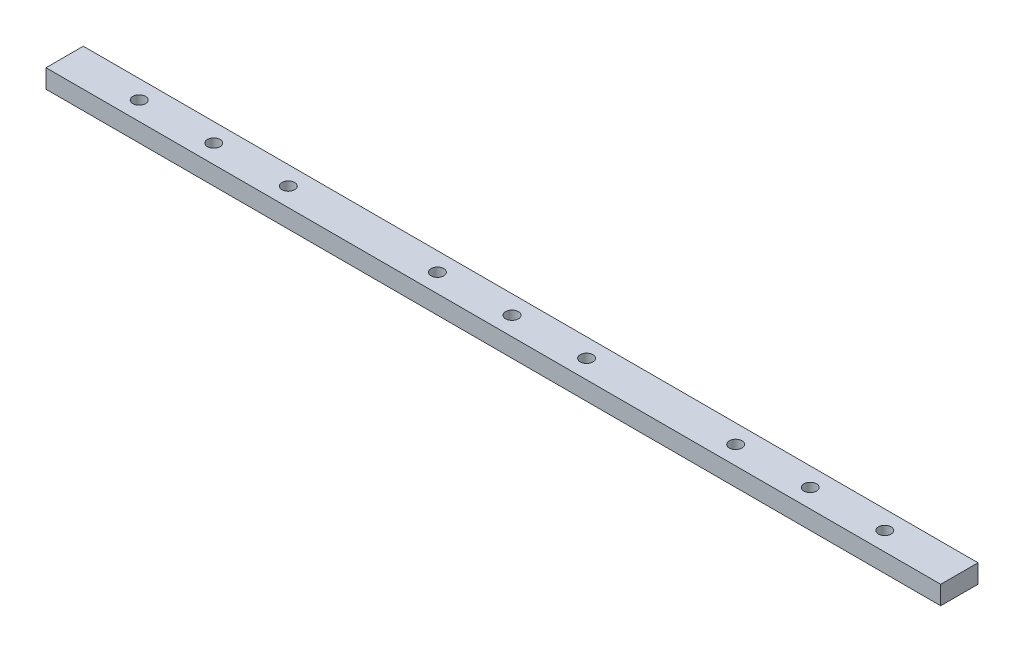
ISO-10303-21;
HEADER;
FILE_DESCRIPTION(('STEP AP214'),'2;1');
FILE_NAME('part.step','',(''),(''),'','','');
FILE_SCHEMA(('AUTOMOTIVE_DESIGN { 1 0 10303 214 1 1 1 1 }'));
ENDSEC;
DATA;
#1=APPLICATION_CONTEXT('core data for automotive mechanical design processes');
#2=APPLICATION_PROTOCOL_DEFINITION('international standard','automotive_design',2000,#1);
#3=PRODUCT_CONTEXT('',#1,'mechanical');
#4=PRODUCT('Part','Part','',(#3));
#5=PRODUCT_RELATED_PRODUCT_CATEGORY('part','',(#4));
#6=PRODUCT_DEFINITION_FORMATION('','',#4);
#7=PRODUCT_DEFINITION_CONTEXT('part definition',#1,'design');
#8=PRODUCT_DEFINITION('design','',#6,#7);
#9=PRODUCT_DEFINITION_SHAPE('','',#8);
#10=(LENGTH_UNIT() NAMED_UNIT(*) SI_UNIT(.MILLI.,.METRE.));
#11=(NAMED_UNIT(*) PLANE_ANGLE_UNIT() SI_UNIT($,.RADIAN.));
#12=(NAMED_UNIT(*) SI_UNIT($,.STERADIAN.) SOLID_ANGLE_UNIT());
#13=UNCERTAINTY_MEASURE_WITH_UNIT(LENGTH_MEASURE(1.E-05),#10,'distance_accuracy_value','');
#14=(GEOMETRIC_REPRESENTATION_CONTEXT(3) GLOBAL_UNCERTAINTY_ASSIGNED_CONTEXT((#13)) GLOBAL_UNIT_ASSIGNED_CONTEXT((#10,
#11,#12)) REPRESENTATION_CONTEXT('',''));
#15=CARTESIAN_POINT('',(0.,0.,0.));
#16=DIRECTION('',(0.,0.,1.));
#17=DIRECTION('',(1.,0.,0.));
#18=AXIS2_PLACEMENT_3D('',#15,#16,#17);
#19=CARTESIAN_POINT('',(0.,5.,0.));
#20=DIRECTION('',(0.,-1.,0.));
#21=DIRECTION('',(0.,0.,-1.));
#22=AXIS2_PLACEMENT_3D('',#19,#20,#21);
#23=PLANE('',#22);
#24=DIRECTION('',(0.,0.,1.));
#25=VECTOR('',#24,1.);
#26=CARTESIAN_POINT('',(0.,5.,0.));
#27=LINE('',#26,#25);
#28=CARTESIAN_POINT('',(0.,5.,-10.));
#29=VERTEX_POINT('',#28);
#30=CARTESIAN_POINT('',(0.,5.,0.));
#31=VERTEX_POINT('',#30);
#32=EDGE_CURVE('E91',#29,#31,#27,.T.);
#33=ORIENTED_EDGE('',*,*,#32,.T.);
#34=DIRECTION('',(1.,0.,0.));
#35=VECTOR('',#34,1.);
#36=CARTESIAN_POINT('',(0.,5.,0.));
#37=LINE('',#36,#35);
#38=CARTESIAN_POINT('',(240.,5.,0.));
#39=VERTEX_POINT('',#38);
#40=EDGE_CURVE('E86',#31,#39,#37,.T.);
#41=ORIENTED_EDGE('',*,*,#40,.T.);
#42=DIRECTION('',(0.,0.,-1.));
#43=VECTOR('',#42,1.);
#44=CARTESIAN_POINT('',(240.,5.,0.));
#45=LINE('',#44,#43);
#46=CARTESIAN_POINT('',(240.,5.,-10.));
#47=VERTEX_POINT('',#46);
#48=EDGE_CURVE('E93',#39,#47,#45,.T.);
#49=ORIENTED_EDGE('',*,*,#48,.T.);
#50=DIRECTION('',(-1.,0.,0.));
#51=VECTOR('',#50,1.);
#52=CARTESIAN_POINT('',(0.,5.,-10.));
#53=LINE('',#52,#51);
#54=EDGE_CURVE('E59',#47,#29,#53,.T.);
#55=ORIENTED_EDGE('',*,*,#54,.T.);
#56=EDGE_LOOP('',(#33,#41,#49,#55));
#57=FACE_BOUND('',#56,.T.);
#58=CARTESIAN_POINT('',(20.,5.,-5.));
#59=DIRECTION('',(0.,1.,0.));
#60=DIRECTION('',(0.,0.,1.));
#61=AXIS2_PLACEMENT_3D('',#58,#59,#60);
#62=CIRCLE('',#61,1.7);
#63=CARTESIAN_POINT('',(20.,5.,-3.3));
#64=VERTEX_POINT('',#63);
#65=EDGE_CURVE('E107',#64,#64,#62,.T.);
#66=ORIENTED_EDGE('',*,*,#65,.F.);
#67=EDGE_LOOP('',(#66));
#68=FACE_BOUND('',#67,.T.);
#69=CARTESIAN_POINT('',(40.,5.,-5.));
#70=DIRECTION('',(0.,1.,0.));
#71=DIRECTION('',(0.,0.,1.));
#72=AXIS2_PLACEMENT_3D('',#69,#70,#71);
#73=CIRCLE('',#72,1.7);
#74=CARTESIAN_POINT('',(40.,5.,-3.3));
#75=VERTEX_POINT('',#74);
#76=EDGE_CURVE('E125',#75,#75,#73,.T.);
#77=ORIENTED_EDGE('',*,*,#76,.F.);
#78=EDGE_LOOP('',(#77));
#79=FACE_BOUND('',#78,.T.);
#80=CARTESIAN_POINT('',(120.,5.,-5.));
#81=DIRECTION('',(0.,1.,0.));
#82=DIRECTION('',(0.,0.,1.));
#83=AXIS2_PLACEMENT_3D('',#80,#81,#82);
#84=CIRCLE('',#83,1.70000000000001);
#85=CARTESIAN_POINT('',(120.,5.,-3.29999999999999));
#86=VERTEX_POINT('',#85);
#87=EDGE_CURVE('E129',#86,#86,#84,.T.);
#88=ORIENTED_EDGE('',*,*,#87,.F.);
#89=EDGE_LOOP('',(#88));
#90=FACE_BOUND('',#89,.T.);
#91=CARTESIAN_POINT('',(60.,5.,-5.));
#92=DIRECTION('',(0.,1.,0.));
#93=DIRECTION('',(0.,0.,1.));
#94=AXIS2_PLACEMENT_3D('',#91,#92,#93);
#95=CIRCLE('',#94,1.7);
#96=CARTESIAN_POINT('',(60.,5.,-3.3));
#97=VERTEX_POINT('',#96);
#98=EDGE_CURVE('E134',#97,#97,#95,.T.);
#99=ORIENTED_EDGE('',*,*,#98,.F.);
#100=EDGE_LOOP('',(#99));
#101=FACE_BOUND('',#100,.T.);
#102=CARTESIAN_POINT('',(140.,5.,-5.));
#103=DIRECTION('',(0.,1.,0.));
#104=DIRECTION('',(0.,0.,-1.));
#105=AXIS2_PLACEMENT_3D('',#102,#103,#104);
#106=CIRCLE('',#105,1.70000000000001);
#107=CARTESIAN_POINT('',(140.,5.,-6.70000000000001));
#108=VERTEX_POINT('',#107);
#109=EDGE_CURVE('E143',#108,#108,#106,.T.);
#110=ORIENTED_EDGE('',*,*,#109,.F.);
#111=EDGE_LOOP('',(#110));
#112=FACE_BOUND('',#111,.T.);
#113=CARTESIAN_POINT('',(100.,5.,-5.));
#114=DIRECTION('',(0.,1.,0.));
#115=DIRECTION('',(0.,0.,1.));
#116=AXIS2_PLACEMENT_3D('',#113,#114,#115);
#117=CIRCLE('',#116,1.70000000000001);
#118=CARTESIAN_POINT('',(100.,5.,-3.29999999999999));
#119=VERTEX_POINT('',#118);
#120=EDGE_CURVE('E150',#119,#119,#117,.T.);
#121=ORIENTED_EDGE('',*,*,#120,.F.);
#122=EDGE_LOOP('',(#121));
#123=FACE_BOUND('',#122,.T.);
#124=CARTESIAN_POINT('',(180.,5.,-5.));
#125=DIRECTION('',(0.,1.,0.));
#126=DIRECTION('',(0.,0.,-1.));
#127=AXIS2_PLACEMENT_3D('',#124,#125,#126);
#128=CIRCLE('',#127,1.69999999999999);
#129=CARTESIAN_POINT('',(180.,5.,-6.69999999999999));
#130=VERTEX_POINT('',#129);
#131=EDGE_CURVE('E153',#130,#130,#128,.T.);
#132=ORIENTED_EDGE('',*,*,#131,.F.);
#133=EDGE_LOOP('',(#132));
#134=FACE_BOUND('',#133,.T.);
#135=CARTESIAN_POINT('',(200.,5.,-5.));
#136=DIRECTION('',(0.,1.,0.));
#137=DIRECTION('',(0.,0.,-1.));
#138=AXIS2_PLACEMENT_3D('',#135,#136,#137);
#139=CIRCLE('',#138,1.70000000000001);
#140=CARTESIAN_POINT('',(200.,5.,-6.70000000000001));
#141=VERTEX_POINT('',#140);
#142=EDGE_CURVE('E157',#141,#141,#139,.T.);
#143=ORIENTED_EDGE('',*,*,#142,.F.);
#144=EDGE_LOOP('',(#143));
#145=FACE_BOUND('',#144,.T.);
#146=CARTESIAN_POINT('',(220.,5.,-5.));
#147=DIRECTION('',(0.,1.,0.));
#148=DIRECTION('',(0.,0.,-1.));
#149=AXIS2_PLACEMENT_3D('',#146,#147,#148);
#150=CIRCLE('',#149,1.69999999999999);
#151=CARTESIAN_POINT('',(220.,5.,-6.69999999999999));
#152=VERTEX_POINT('',#151);
#153=EDGE_CURVE('E164',#152,#152,#150,.T.);
#154=ORIENTED_EDGE('',*,*,#153,.F.);
#155=EDGE_LOOP('',(#154));
#156=FACE_BOUND('',#155,.T.);
#157=ADVANCED_FACE('F41',(#57,#68,#79,#90,#101,#112,#123,#134,#145,#156),#23,.F.);
#158=CARTESIAN_POINT('',(0.,0.,0.));
#159=DIRECTION('',(0.,-1.,0.));
#160=DIRECTION('',(0.,0.,-1.));
#161=AXIS2_PLACEMENT_3D('',#158,#159,#160);
#162=PLANE('',#161);
#163=CARTESIAN_POINT('',(200.,0.,-5.));
#164=DIRECTION('',(0.,1.,0.));
#165=DIRECTION('',(0.,0.,-1.));
#166=AXIS2_PLACEMENT_3D('',#163,#164,#165);
#167=CIRCLE('',#166,1.70000000000001);
#168=CARTESIAN_POINT('',(200.,0.,-6.70000000000001));
#169=VERTEX_POINT('',#168);
#170=EDGE_CURVE('E165',#169,#169,#167,.T.);
#171=ORIENTED_EDGE('',*,*,#170,.T.);
#172=EDGE_LOOP('',(#171));
#173=FACE_BOUND('',#172,.T.);
#174=CARTESIAN_POINT('',(100.,0.,-5.));
#175=DIRECTION('',(0.,1.,0.));
#176=DIRECTION('',(0.,0.,1.));
#177=AXIS2_PLACEMENT_3D('',#174,#175,#176);
#178=CIRCLE('',#177,1.70000000000001);
#179=CARTESIAN_POINT('',(100.,0.,-3.29999999999999));
#180=VERTEX_POINT('',#179);
#181=EDGE_CURVE('E147',#180,#180,#178,.T.);
#182=ORIENTED_EDGE('',*,*,#181,.T.);
#183=EDGE_LOOP('',(#182));
#184=FACE_BOUND('',#183,.T.);
#185=CARTESIAN_POINT('',(60.,0.,-5.));
#186=DIRECTION('',(0.,1.,0.));
#187=DIRECTION('',(0.,0.,1.));
#188=AXIS2_PLACEMENT_3D('',#185,#186,#187);
#189=CIRCLE('',#188,1.7);
#190=CARTESIAN_POINT('',(60.,0.,-3.3));
#191=VERTEX_POINT('',#190);
#192=EDGE_CURVE('E140',#191,#191,#189,.T.);
#193=ORIENTED_EDGE('',*,*,#192,.T.);
#194=EDGE_LOOP('',(#193));
#195=FACE_BOUND('',#194,.T.);
#196=CARTESIAN_POINT('',(40.,0.,-5.));
#197=DIRECTION('',(0.,1.,0.));
#198=DIRECTION('',(0.,0.,1.));
#199=AXIS2_PLACEMENT_3D('',#196,#197,#198);
#200=CIRCLE('',#199,1.7);
#201=CARTESIAN_POINT('',(40.,0.,-3.3));
#202=VERTEX_POINT('',#201);
#203=EDGE_CURVE('E127',#202,#202,#200,.T.);
#204=ORIENTED_EDGE('',*,*,#203,.T.);
#205=EDGE_LOOP('',(#204));
#206=FACE_BOUND('',#205,.T.);
#207=DIRECTION('',(0.,0.,1.));
#208=VECTOR('',#207,1.);
#209=CARTESIAN_POINT('',(0.,0.,0.));
#210=LINE('',#209,#208);
#211=CARTESIAN_POINT('',(0.,0.,-10.));
#212=VERTEX_POINT('',#211);
#213=CARTESIAN_POINT('',(0.,0.,0.));
#214=VERTEX_POINT('',#213);
#215=EDGE_CURVE('E104',#212,#214,#210,.T.);
#216=ORIENTED_EDGE('',*,*,#215,.F.);
#217=DIRECTION('',(-1.,0.,0.));
#218=VECTOR('',#217,1.);
#219=CARTESIAN_POINT('',(0.,0.,-10.));
#220=LINE('',#219,#218);
#221=CARTESIAN_POINT('',(240.,0.,-10.));
#222=VERTEX_POINT('',#221);
#223=EDGE_CURVE('E82',#222,#212,#220,.T.);
#224=ORIENTED_EDGE('',*,*,#223,.F.);
#225=DIRECTION('',(0.,0.,-1.));
#226=VECTOR('',#225,1.);
#227=CARTESIAN_POINT('',(240.,0.,0.));
#228=LINE('',#227,#226);
#229=CARTESIAN_POINT('',(240.,0.,0.));
#230=VERTEX_POINT('',#229);
#231=EDGE_CURVE('E73',#230,#222,#228,.T.);
#232=ORIENTED_EDGE('',*,*,#231,.F.);
#233=DIRECTION('',(1.,0.,0.));
#234=VECTOR('',#233,1.);
#235=CARTESIAN_POINT('',(0.,0.,0.));
#236=LINE('',#235,#234);
#237=EDGE_CURVE('E100',#214,#230,#236,.T.);
#238=ORIENTED_EDGE('',*,*,#237,.F.);
#239=EDGE_LOOP('',(#216,#224,#232,#238));
#240=FACE_BOUND('',#239,.T.);
#241=CARTESIAN_POINT('',(20.,0.,-5.));
#242=DIRECTION('',(0.,1.,0.));
#243=DIRECTION('',(0.,0.,1.));
#244=AXIS2_PLACEMENT_3D('',#241,#242,#243);
#245=CIRCLE('',#244,1.7);
#246=CARTESIAN_POINT('',(20.,0.,-3.3));
#247=VERTEX_POINT('',#246);
#248=EDGE_CURVE('E119',#247,#247,#245,.T.);
#249=ORIENTED_EDGE('',*,*,#248,.T.);
#250=EDGE_LOOP('',(#249));
#251=FACE_BOUND('',#250,.T.);
#252=CARTESIAN_POINT('',(120.,0.,-5.));
#253=DIRECTION('',(0.,1.,0.));
#254=DIRECTION('',(0.,0.,1.));
#255=AXIS2_PLACEMENT_3D('',#252,#253,#254);
#256=CIRCLE('',#255,1.70000000000001);
#257=CARTESIAN_POINT('',(120.,0.,-3.29999999999999));
#258=VERTEX_POINT('',#257);
#259=EDGE_CURVE('E135',#258,#258,#256,.T.);
#260=ORIENTED_EDGE('',*,*,#259,.T.);
#261=EDGE_LOOP('',(#260));
#262=FACE_BOUND('',#261,.T.);
#263=CARTESIAN_POINT('',(140.,0.,-5.));
#264=DIRECTION('',(0.,1.,0.));
#265=DIRECTION('',(0.,0.,-1.));
#266=AXIS2_PLACEMENT_3D('',#263,#264,#265);
#267=CIRCLE('',#266,1.70000000000001);
#268=CARTESIAN_POINT('',(140.,0.,-6.70000000000001));
#269=VERTEX_POINT('',#268);
#270=EDGE_CURVE('E145',#269,#269,#267,.T.);
#271=ORIENTED_EDGE('',*,*,#270,.T.);
#272=EDGE_LOOP('',(#271));
#273=FACE_BOUND('',#272,.T.);
#274=CARTESIAN_POINT('',(180.,0.,-5.));
#275=DIRECTION('',(0.,1.,0.));
#276=DIRECTION('',(0.,0.,-1.));
#277=AXIS2_PLACEMENT_3D('',#274,#275,#276);
#278=CIRCLE('',#277,1.69999999999999);
#279=CARTESIAN_POINT('',(180.,0.,-6.69999999999999));
#280=VERTEX_POINT('',#279);
#281=EDGE_CURVE('E156',#280,#280,#278,.T.);
#282=ORIENTED_EDGE('',*,*,#281,.T.);
#283=EDGE_LOOP('',(#282));
#284=FACE_BOUND('',#283,.T.);
#285=CARTESIAN_POINT('',(220.,0.,-5.));
#286=DIRECTION('',(0.,1.,0.));
#287=DIRECTION('',(0.,0.,-1.));
#288=AXIS2_PLACEMENT_3D('',#285,#286,#287);
#289=CIRCLE('',#288,1.69999999999999);
#290=CARTESIAN_POINT('',(220.,0.,-6.69999999999999));
#291=VERTEX_POINT('',#290);
#292=EDGE_CURVE('E169',#291,#291,#289,.T.);
#293=ORIENTED_EDGE('',*,*,#292,.T.);
#294=EDGE_LOOP('',(#293));
#295=FACE_BOUND('',#294,.T.);
#296=ADVANCED_FACE('F116',(#173,#184,#195,#206,#240,#251,#262,#273,#284,#295),#162,.T.);
#297=CARTESIAN_POINT('',(0.,5.,0.));
#298=DIRECTION('',(1.,0.,0.));
#299=DIRECTION('',(0.,0.,-1.));
#300=AXIS2_PLACEMENT_3D('',#297,#298,#299);
#301=PLANE('',#300);
#302=ORIENTED_EDGE('',*,*,#215,.T.);
#303=DIRECTION('',(0.,-1.,0.));
#304=VECTOR('',#303,1.);
#305=CARTESIAN_POINT('',(0.,5.,0.));
#306=LINE('',#305,#304);
#307=EDGE_CURVE('E11',#31,#214,#306,.T.);
#308=ORIENTED_EDGE('',*,*,#307,.F.);
#309=ORIENTED_EDGE('',*,*,#32,.F.);
#310=DIRECTION('',(0.,-1.,0.));
#311=VECTOR('',#310,1.);
#312=CARTESIAN_POINT('',(0.,5.,-10.));
#313=LINE('',#312,#311);
#314=EDGE_CURVE('E101',#29,#212,#313,.T.);
#315=ORIENTED_EDGE('',*,*,#314,.T.);
#316=EDGE_LOOP('',(#302,#308,#309,#315));
#317=FACE_BOUND('',#316,.T.);
#318=ADVANCED_FACE('F43',(#317),#301,.F.);
#319=CARTESIAN_POINT('',(0.,5.,0.));
#320=DIRECTION('',(0.,0.,-1.));
#321=DIRECTION('',(-1.,0.,0.));
#322=AXIS2_PLACEMENT_3D('',#319,#320,#321);
#323=PLANE('',#322);
#324=ORIENTED_EDGE('',*,*,#237,.T.);
#325=DIRECTION('',(0.,-1.,0.));
#326=VECTOR('',#325,1.);
#327=CARTESIAN_POINT('',(240.,5.,0.));
#328=LINE('',#327,#326);
#329=EDGE_CURVE('E49',#39,#230,#328,.T.);
#330=ORIENTED_EDGE('',*,*,#329,.F.);
#331=ORIENTED_EDGE('',*,*,#40,.F.);
#332=ORIENTED_EDGE('',*,*,#307,.T.);
#333=EDGE_LOOP('',(#324,#330,#331,#332));
#334=FACE_BOUND('',#333,.T.);
#335=ADVANCED_FACE('F96',(#334),#323,.F.);
#336=CARTESIAN_POINT('',(240.,5.,0.));
#337=DIRECTION('',(-1.,0.,0.));
#338=DIRECTION('',(0.,0.,1.));
#339=AXIS2_PLACEMENT_3D('',#336,#337,#338);
#340=PLANE('',#339);
#341=ORIENTED_EDGE('',*,*,#231,.T.);
#342=DIRECTION('',(0.,-1.,0.));
#343=VECTOR('',#342,1.);
#344=CARTESIAN_POINT('',(240.,5.,-10.));
#345=LINE('',#344,#343);
#346=EDGE_CURVE('E98',#47,#222,#345,.T.);
#347=ORIENTED_EDGE('',*,*,#346,.F.);
#348=ORIENTED_EDGE('',*,*,#48,.F.);
#349=ORIENTED_EDGE('',*,*,#329,.T.);
#350=EDGE_LOOP('',(#341,#347,#348,#349));
#351=FACE_BOUND('',#350,.T.);
#352=ADVANCED_FACE('F97',(#351),#340,.F.);
#353=CARTESIAN_POINT('',(0.,5.,-10.));
#354=DIRECTION('',(0.,0.,1.));
#355=DIRECTION('',(1.,0.,0.));
#356=AXIS2_PLACEMENT_3D('',#353,#354,#355);
#357=PLANE('',#356);
#358=ORIENTED_EDGE('',*,*,#223,.T.);
#359=ORIENTED_EDGE('',*,*,#314,.F.);
#360=ORIENTED_EDGE('',*,*,#54,.F.);
#361=ORIENTED_EDGE('',*,*,#346,.T.);
#362=EDGE_LOOP('',(#358,#359,#360,#361));
#363=FACE_BOUND('',#362,.T.);
#364=ADVANCED_FACE('F114',(#363),#357,.F.);
#365=CARTESIAN_POINT('',(20.,5.,-5.));
#366=DIRECTION('',(0.,-1.,0.));
#367=DIRECTION('',(0.,0.,-1.));
#368=AXIS2_PLACEMENT_3D('',#365,#366,#367);
#369=CYLINDRICAL_SURFACE('',#368,1.7);
#370=ORIENTED_EDGE('',*,*,#65,.T.);
#371=EDGE_LOOP('',(#370));
#372=FACE_BOUND('',#371,.T.);
#373=ORIENTED_EDGE('',*,*,#248,.F.);
#374=EDGE_LOOP('',(#373));
#375=FACE_BOUND('',#374,.T.);
#376=ADVANCED_FACE('F183',(#372,#375),#369,.F.);
#377=CARTESIAN_POINT('',(40.,5.,-5.));
#378=DIRECTION('',(0.,-1.,0.));
#379=DIRECTION('',(0.,0.,-1.));
#380=AXIS2_PLACEMENT_3D('',#377,#378,#379);
#381=CYLINDRICAL_SURFACE('',#380,1.7);
#382=ORIENTED_EDGE('',*,*,#76,.T.);
#383=EDGE_LOOP('',(#382));
#384=FACE_BOUND('',#383,.T.);
#385=ORIENTED_EDGE('',*,*,#203,.F.);
#386=EDGE_LOOP('',(#385));
#387=FACE_BOUND('',#386,.T.);
#388=ADVANCED_FACE('F229',(#384,#387),#381,.F.);
#389=CARTESIAN_POINT('',(120.,5.,-5.));
#390=DIRECTION('',(0.,-1.,0.));
#391=DIRECTION('',(0.,0.,-1.));
#392=AXIS2_PLACEMENT_3D('',#389,#390,#391);
#393=CYLINDRICAL_SURFACE('',#392,1.70000000000001);
#394=ORIENTED_EDGE('',*,*,#87,.T.);
#395=EDGE_LOOP('',(#394));
#396=FACE_BOUND('',#395,.T.);
#397=ORIENTED_EDGE('',*,*,#259,.F.);
#398=EDGE_LOOP('',(#397));
#399=FACE_BOUND('',#398,.T.);
#400=ADVANCED_FACE('F236',(#396,#399),#393,.F.);
#401=CARTESIAN_POINT('',(60.,5.,-5.));
#402=DIRECTION('',(0.,-1.,0.));
#403=DIRECTION('',(0.,0.,-1.));
#404=AXIS2_PLACEMENT_3D('',#401,#402,#403);
#405=CYLINDRICAL_SURFACE('',#404,1.7);
#406=ORIENTED_EDGE('',*,*,#98,.T.);
#407=EDGE_LOOP('',(#406));
#408=FACE_BOUND('',#407,.T.);
#409=ORIENTED_EDGE('',*,*,#192,.F.);
#410=EDGE_LOOP('',(#409));
#411=FACE_BOUND('',#410,.T.);
#412=ADVANCED_FACE('F247',(#408,#411),#405,.F.);
#413=CARTESIAN_POINT('',(140.,5.,-5.));
#414=DIRECTION('',(0.,-1.,0.));
#415=DIRECTION('',(0.,0.,-1.));
#416=AXIS2_PLACEMENT_3D('',#413,#414,#415);
#417=CYLINDRICAL_SURFACE('',#416,1.70000000000001);
#418=ORIENTED_EDGE('',*,*,#109,.T.);
#419=EDGE_LOOP('',(#418));
#420=FACE_BOUND('',#419,.T.);
#421=ORIENTED_EDGE('',*,*,#270,.F.);
#422=EDGE_LOOP('',(#421));
#423=FACE_BOUND('',#422,.T.);
#424=ADVANCED_FACE('F254',(#420,#423),#417,.F.);
#425=CARTESIAN_POINT('',(100.,5.,-5.));
#426=DIRECTION('',(0.,-1.,0.));
#427=DIRECTION('',(0.,0.,-1.));
#428=AXIS2_PLACEMENT_3D('',#425,#426,#427);
#429=CYLINDRICAL_SURFACE('',#428,1.70000000000001);
#430=ORIENTED_EDGE('',*,*,#120,.T.);
#431=EDGE_LOOP('',(#430));
#432=FACE_BOUND('',#431,.T.);
#433=ORIENTED_EDGE('',*,*,#181,.F.);
#434=EDGE_LOOP('',(#433));
#435=FACE_BOUND('',#434,.T.);
#436=ADVANCED_FACE('F262',(#432,#435),#429,.F.);
#437=CARTESIAN_POINT('',(180.,5.,-5.));
#438=DIRECTION('',(0.,-1.,0.));
#439=DIRECTION('',(0.,0.,-1.));
#440=AXIS2_PLACEMENT_3D('',#437,#438,#439);
#441=CYLINDRICAL_SURFACE('',#440,1.69999999999999);
#442=ORIENTED_EDGE('',*,*,#131,.T.);
#443=EDGE_LOOP('',(#442));
#444=FACE_BOUND('',#443,.T.);
#445=ORIENTED_EDGE('',*,*,#281,.F.);
#446=EDGE_LOOP('',(#445));
#447=FACE_BOUND('',#446,.T.);
#448=ADVANCED_FACE('F272',(#444,#447),#441,.F.);
#449=CARTESIAN_POINT('',(200.,5.,-5.));
#450=DIRECTION('',(0.,-1.,0.));
#451=DIRECTION('',(0.,0.,-1.));
#452=AXIS2_PLACEMENT_3D('',#449,#450,#451);
#453=CYLINDRICAL_SURFACE('',#452,1.70000000000001);
#454=ORIENTED_EDGE('',*,*,#142,.T.);
#455=EDGE_LOOP('',(#454));
#456=FACE_BOUND('',#455,.T.);
#457=ORIENTED_EDGE('',*,*,#170,.F.);
#458=EDGE_LOOP('',(#457));
#459=FACE_BOUND('',#458,.T.);
#460=ADVANCED_FACE('F285',(#456,#459),#453,.F.);
#461=CARTESIAN_POINT('',(220.,5.,-5.));
#462=DIRECTION('',(0.,-1.,0.));
#463=DIRECTION('',(0.,0.,-1.));
#464=AXIS2_PLACEMENT_3D('',#461,#462,#463);
#465=CYLINDRICAL_SURFACE('',#464,1.69999999999999);
#466=ORIENTED_EDGE('',*,*,#153,.T.);
#467=EDGE_LOOP('',(#466));
#468=FACE_BOUND('',#467,.T.);
#469=ORIENTED_EDGE('',*,*,#292,.F.);
#470=EDGE_LOOP('',(#469));
#471=FACE_BOUND('',#470,.T.);
#472=ADVANCED_FACE('F173',(#468,#471),#465,.F.);
#473=CLOSED_SHELL('',(#157,#296,#318,#335,#352,#364,#376,#388,#400,#412,#424,#436,#448,#460,#472));
#474=MANIFOLD_SOLID_BREP('B2',#473);
#475=ADVANCED_BREP_SHAPE_REPRESENTATION('',(#18,#474),#14);
#476=SHAPE_DEFINITION_REPRESENTATION(#9,#475);
ENDSEC;
END-ISO-10303-21;
